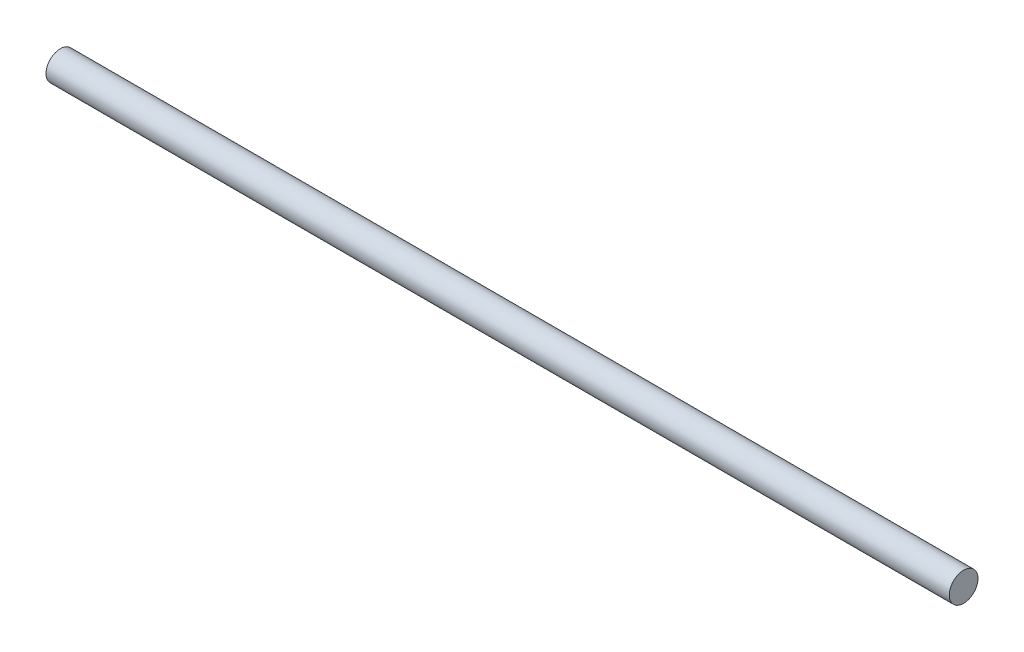
ISO-10303-21;
HEADER;
FILE_DESCRIPTION(('STEP AP214'),'2;1');
FILE_NAME('part.step','',(''),(''),'','','');
FILE_SCHEMA(('AUTOMOTIVE_DESIGN { 1 0 10303 214 1 1 1 1 }'));
ENDSEC;
DATA;
#1=APPLICATION_CONTEXT('core data for automotive mechanical design processes');
#2=APPLICATION_PROTOCOL_DEFINITION('international standard','automotive_design',2000,#1);
#3=PRODUCT_CONTEXT('',#1,'mechanical');
#4=PRODUCT('Part','Part','',(#3));
#5=PRODUCT_RELATED_PRODUCT_CATEGORY('part','',(#4));
#6=PRODUCT_DEFINITION_FORMATION('','',#4);
#7=PRODUCT_DEFINITION_CONTEXT('part definition',#1,'design');
#8=PRODUCT_DEFINITION('design','',#6,#7);
#9=PRODUCT_DEFINITION_SHAPE('','',#8);
#10=(LENGTH_UNIT() NAMED_UNIT(*) SI_UNIT(.MILLI.,.METRE.));
#11=(NAMED_UNIT(*) PLANE_ANGLE_UNIT() SI_UNIT($,.RADIAN.));
#12=(NAMED_UNIT(*) SI_UNIT($,.STERADIAN.) SOLID_ANGLE_UNIT());
#13=UNCERTAINTY_MEASURE_WITH_UNIT(LENGTH_MEASURE(1.E-05),#10,'distance_accuracy_value','');
#14=(GEOMETRIC_REPRESENTATION_CONTEXT(3) GLOBAL_UNCERTAINTY_ASSIGNED_CONTEXT((#13)) GLOBAL_UNIT_ASSIGNED_CONTEXT((#10,
#11,#12)) REPRESENTATION_CONTEXT('',''));
#15=CARTESIAN_POINT('',(0.,0.,0.));
#16=DIRECTION('',(0.,0.,1.));
#17=DIRECTION('',(1.,0.,0.));
#18=AXIS2_PLACEMENT_3D('',#15,#16,#17);
#19=CARTESIAN_POINT('',(133.76592212442,0.,13.1211032137818));
#20=DIRECTION('',(-1.,0.,0.));
#21=DIRECTION('',(0.,0.,1.));
#22=AXIS2_PLACEMENT_3D('',#19,#20,#21);
#23=PLANE('',#22);
#24=CARTESIAN_POINT('',(133.76592212442,0.,13.1211032137818));
#25=DIRECTION('',(1.,0.,0.));
#26=DIRECTION('',(0.,0.,-1.));
#27=AXIS2_PLACEMENT_3D('',#24,#25,#26);
#28=CIRCLE('',#27,2.99999999999902);
#29=CARTESIAN_POINT('',(133.76592212442,0.,10.1211032137828));
#30=VERTEX_POINT('',#29);
#31=EDGE_CURVE('E10',#30,#30,#28,.T.);
#32=ORIENTED_EDGE('',*,*,#31,.T.);
#33=EDGE_LOOP('',(#32));
#34=FACE_BOUND('',#33,.T.);
#35=ADVANCED_FACE('F31',(#34),#23,.F.);
#36=CARTESIAN_POINT('',(133.76592212442,0.,13.1211032137818));
#37=DIRECTION('',(1.,0.,0.));
#38=DIRECTION('',(0.,0.,-1.));
#39=AXIS2_PLACEMENT_3D('',#36,#37,#38);
#40=CYLINDRICAL_SURFACE('',#39,2.99999999999951);
#41=ORIENTED_EDGE('',*,*,#31,.F.);
#42=EDGE_LOOP('',(#41));
#43=FACE_BOUND('',#42,.T.);
#44=CARTESIAN_POINT('',(-54.70067787558,0.,13.1211032137804));
#45=DIRECTION('',(-1.,0.,0.));
#46=DIRECTION('',(0.,0.,1.));
#47=AXIS2_PLACEMENT_3D('',#44,#45,#46);
#48=CIRCLE('',#47,3.);
#49=CARTESIAN_POINT('',(-54.70067787558,0.,16.1211032137804));
#50=VERTEX_POINT('',#49);
#51=EDGE_CURVE('E37',#50,#50,#48,.T.);
#52=ORIENTED_EDGE('',*,*,#51,.F.);
#53=EDGE_LOOP('',(#52));
#54=FACE_BOUND('',#53,.T.);
#55=ADVANCED_FACE('F45',(#43,#54),#40,.T.);
#56=CARTESIAN_POINT('',(-54.70067787558,0.,13.1211032137804));
#57=DIRECTION('',(-1.,0.,0.));
#58=DIRECTION('',(0.,0.,1.));
#59=AXIS2_PLACEMENT_3D('',#56,#57,#58);
#60=PLANE('',#59);
#61=ORIENTED_EDGE('',*,*,#51,.T.);
#62=EDGE_LOOP('',(#61));
#63=FACE_BOUND('',#62,.T.);
#64=ADVANCED_FACE('F43',(#63),#60,.T.);
#65=CLOSED_SHELL('',(#35,#55,#64));
#66=MANIFOLD_SOLID_BREP('B2',#65);
#67=ADVANCED_BREP_SHAPE_REPRESENTATION('',(#18,#66),#14);
#68=SHAPE_DEFINITION_REPRESENTATION(#9,#67);
ENDSEC;
END-ISO-10303-21;
